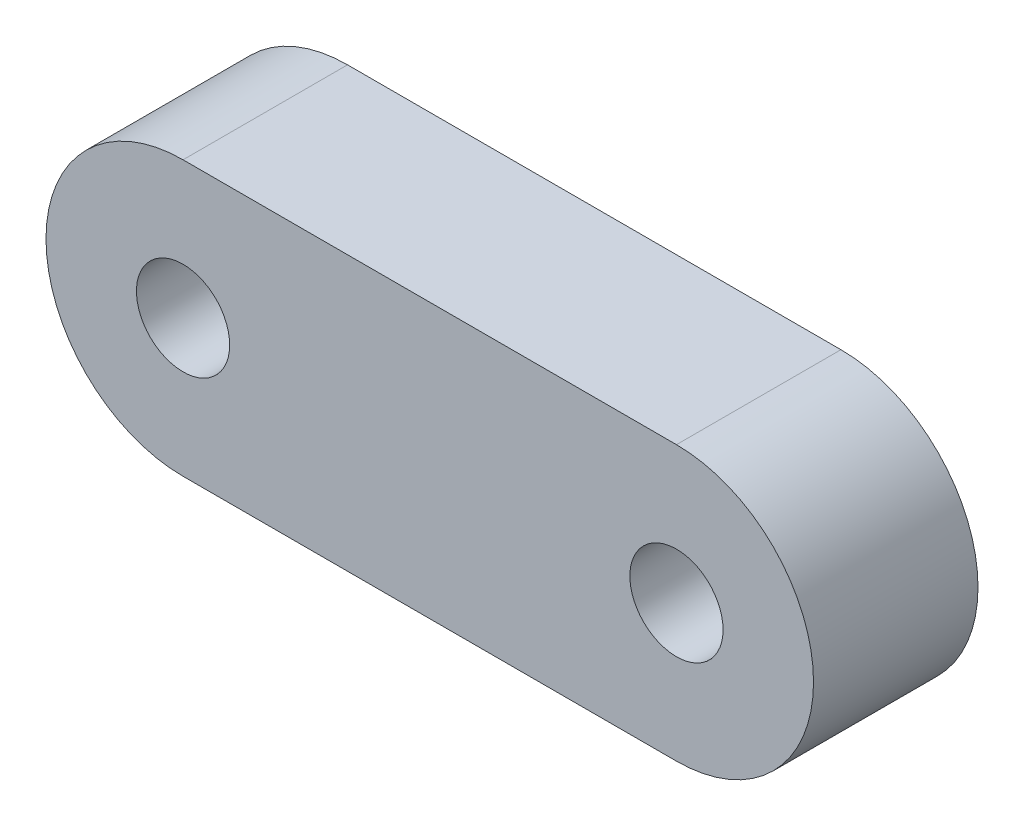
ISO-10303-21;
HEADER;
FILE_DESCRIPTION(('STEP AP214'),'2;1');
FILE_NAME('part.step','',(''),(''),'','','');
FILE_SCHEMA(('AUTOMOTIVE_DESIGN { 1 0 10303 214 1 1 1 1 }'));
ENDSEC;
DATA;
#1=APPLICATION_CONTEXT('core data for automotive mechanical design processes');
#2=APPLICATION_PROTOCOL_DEFINITION('international standard','automotive_design',2000,#1);
#3=PRODUCT_CONTEXT('',#1,'mechanical');
#4=PRODUCT('Part','Part','',(#3));
#5=PRODUCT_RELATED_PRODUCT_CATEGORY('part','',(#4));
#6=PRODUCT_DEFINITION_FORMATION('','',#4);
#7=PRODUCT_DEFINITION_CONTEXT('part definition',#1,'design');
#8=PRODUCT_DEFINITION('design','',#6,#7);
#9=PRODUCT_DEFINITION_SHAPE('','',#8);
#10=(LENGTH_UNIT() NAMED_UNIT(*) SI_UNIT(.MILLI.,.METRE.));
#11=(NAMED_UNIT(*) PLANE_ANGLE_UNIT() SI_UNIT($,.RADIAN.));
#12=(NAMED_UNIT(*) SI_UNIT($,.STERADIAN.) SOLID_ANGLE_UNIT());
#13=UNCERTAINTY_MEASURE_WITH_UNIT(LENGTH_MEASURE(1.E-05),#10,'distance_accuracy_value','');
#14=(GEOMETRIC_REPRESENTATION_CONTEXT(3) GLOBAL_UNCERTAINTY_ASSIGNED_CONTEXT((#13)) GLOBAL_UNIT_ASSIGNED_CONTEXT((#10,
#11,#12)) REPRESENTATION_CONTEXT('',''));
#15=CARTESIAN_POINT('',(0.,0.,0.));
#16=DIRECTION('',(0.,0.,1.));
#17=DIRECTION('',(1.,0.,0.));
#18=AXIS2_PLACEMENT_3D('',#15,#16,#17);
#19=CARTESIAN_POINT('',(7.56,0.,6.));
#20=DIRECTION('',(0.,0.,1.));
#21=DIRECTION('',(1.,0.,0.));
#22=AXIS2_PLACEMENT_3D('',#19,#20,#21);
#23=PLANE('',#22);
#24=CARTESIAN_POINT('',(7.56,0.,6.));
#25=DIRECTION('',(0.,0.,1.));
#26=DIRECTION('',(1.,0.,0.));
#27=AXIS2_PLACEMENT_3D('',#24,#25,#26);
#28=CIRCLE('',#27,1.7);
#29=CARTESIAN_POINT('',(9.26,0.,6.));
#30=VERTEX_POINT('',#29);
#31=EDGE_CURVE('E101',#30,#30,#28,.T.);
#32=ORIENTED_EDGE('',*,*,#31,.F.);
#33=EDGE_LOOP('',(#32));
#34=FACE_BOUND('',#33,.T.);
#35=CARTESIAN_POINT('',(7.56,0.,6.));
#36=DIRECTION('',(0.,0.,1.));
#37=DIRECTION('',(1.,0.,0.));
#38=AXIS2_PLACEMENT_3D('',#35,#36,#37);
#39=CIRCLE('',#38,5.);
#40=CARTESIAN_POINT('',(7.56,5.,6.));
#41=VERTEX_POINT('',#40);
#42=CARTESIAN_POINT('',(7.56,-5.,6.));
#43=VERTEX_POINT('',#42);
#44=EDGE_CURVE('E86',#41,#43,#39,.T.);
#45=ORIENTED_EDGE('',*,*,#44,.T.);
#46=DIRECTION('',(1.,0.,0.));
#47=VECTOR('',#46,1.);
#48=CARTESIAN_POINT('',(7.56,-5.,6.));
#49=LINE('',#48,#47);
#50=CARTESIAN_POINT('',(25.56,-5.,6.));
#51=VERTEX_POINT('',#50);
#52=EDGE_CURVE('E81',#43,#51,#49,.T.);
#53=ORIENTED_EDGE('',*,*,#52,.T.);
#54=CARTESIAN_POINT('',(25.56,0.,6.));
#55=DIRECTION('',(0.,0.,1.));
#56=DIRECTION('',(1.,0.,0.));
#57=AXIS2_PLACEMENT_3D('',#54,#55,#56);
#58=CIRCLE('',#57,5.);
#59=CARTESIAN_POINT('',(25.56,5.,6.));
#60=VERTEX_POINT('',#59);
#61=EDGE_CURVE('E84',#51,#60,#58,.T.);
#62=ORIENTED_EDGE('',*,*,#61,.T.);
#63=DIRECTION('',(-1.,0.,0.));
#64=VECTOR('',#63,1.);
#65=CARTESIAN_POINT('',(7.56,5.,6.));
#66=LINE('',#65,#64);
#67=EDGE_CURVE('E51',#60,#41,#66,.T.);
#68=ORIENTED_EDGE('',*,*,#67,.T.);
#69=EDGE_LOOP('',(#45,#53,#62,#68));
#70=FACE_BOUND('',#69,.T.);
#71=CARTESIAN_POINT('',(25.56,0.,6.));
#72=DIRECTION('',(0.,0.,1.));
#73=DIRECTION('',(1.,0.,0.));
#74=AXIS2_PLACEMENT_3D('',#71,#72,#73);
#75=CIRCLE('',#74,1.7);
#76=CARTESIAN_POINT('',(27.26,0.,6.));
#77=VERTEX_POINT('',#76);
#78=EDGE_CURVE('E116',#77,#77,#75,.T.);
#79=ORIENTED_EDGE('',*,*,#78,.F.);
#80=EDGE_LOOP('',(#79));
#81=FACE_BOUND('',#80,.T.);
#82=ADVANCED_FACE('F34',(#34,#70,#81),#23,.T.);
#83=CARTESIAN_POINT('',(7.56,0.,0.));
#84=DIRECTION('',(0.,0.,1.));
#85=DIRECTION('',(1.,0.,0.));
#86=AXIS2_PLACEMENT_3D('',#83,#84,#85);
#87=PLANE('',#86);
#88=CARTESIAN_POINT('',(7.56,0.,0.));
#89=DIRECTION('',(0.,0.,1.));
#90=DIRECTION('',(1.,0.,0.));
#91=AXIS2_PLACEMENT_3D('',#88,#89,#90);
#92=CIRCLE('',#91,1.7);
#93=CARTESIAN_POINT('',(9.26,0.,0.));
#94=VERTEX_POINT('',#93);
#95=EDGE_CURVE('E113',#94,#94,#92,.T.);
#96=ORIENTED_EDGE('',*,*,#95,.T.);
#97=EDGE_LOOP('',(#96));
#98=FACE_BOUND('',#97,.T.);
#99=CARTESIAN_POINT('',(7.56,0.,0.));
#100=DIRECTION('',(0.,0.,1.));
#101=DIRECTION('',(1.,0.,0.));
#102=AXIS2_PLACEMENT_3D('',#99,#100,#101);
#103=CIRCLE('',#102,5.);
#104=CARTESIAN_POINT('',(7.56,5.,0.));
#105=VERTEX_POINT('',#104);
#106=CARTESIAN_POINT('',(7.56,-5.,0.));
#107=VERTEX_POINT('',#106);
#108=EDGE_CURVE('E98',#105,#107,#103,.T.);
#109=ORIENTED_EDGE('',*,*,#108,.F.);
#110=DIRECTION('',(-1.,0.,0.));
#111=VECTOR('',#110,1.);
#112=CARTESIAN_POINT('',(7.56,5.,0.));
#113=LINE('',#112,#111);
#114=CARTESIAN_POINT('',(25.56,5.,0.));
#115=VERTEX_POINT('',#114);
#116=EDGE_CURVE('E74',#115,#105,#113,.T.);
#117=ORIENTED_EDGE('',*,*,#116,.F.);
#118=CARTESIAN_POINT('',(25.56,0.,0.));
#119=DIRECTION('',(0.,0.,1.));
#120=DIRECTION('',(1.,0.,0.));
#121=AXIS2_PLACEMENT_3D('',#118,#119,#120);
#122=CIRCLE('',#121,5.);
#123=CARTESIAN_POINT('',(25.56,-5.,0.));
#124=VERTEX_POINT('',#123);
#125=EDGE_CURVE('E68',#124,#115,#122,.T.);
#126=ORIENTED_EDGE('',*,*,#125,.F.);
#127=DIRECTION('',(1.,0.,0.));
#128=VECTOR('',#127,1.);
#129=CARTESIAN_POINT('',(7.56,-5.,0.));
#130=LINE('',#129,#128);
#131=EDGE_CURVE('E90',#107,#124,#130,.T.);
#132=ORIENTED_EDGE('',*,*,#131,.F.);
#133=EDGE_LOOP('',(#109,#117,#126,#132));
#134=FACE_BOUND('',#133,.T.);
#135=CARTESIAN_POINT('',(25.56,0.,0.));
#136=DIRECTION('',(0.,0.,1.));
#137=DIRECTION('',(1.,0.,0.));
#138=AXIS2_PLACEMENT_3D('',#135,#136,#137);
#139=CIRCLE('',#138,1.7);
#140=CARTESIAN_POINT('',(27.26,0.,0.));
#141=VERTEX_POINT('',#140);
#142=EDGE_CURVE('E119',#141,#141,#139,.T.);
#143=ORIENTED_EDGE('',*,*,#142,.T.);
#144=EDGE_LOOP('',(#143));
#145=FACE_BOUND('',#144,.T.);
#146=ADVANCED_FACE('F109',(#98,#134,#145),#87,.F.);
#147=CARTESIAN_POINT('',(7.56,0.,6.));
#148=DIRECTION('',(0.,0.,-1.));
#149=DIRECTION('',(-1.,0.,0.));
#150=AXIS2_PLACEMENT_3D('',#147,#148,#149);
#151=CYLINDRICAL_SURFACE('',#150,5.);
#152=ORIENTED_EDGE('',*,*,#108,.T.);
#153=DIRECTION('',(0.,0.,-1.));
#154=VECTOR('',#153,1.);
#155=CARTESIAN_POINT('',(7.56,-5.,6.));
#156=LINE('',#155,#154);
#157=EDGE_CURVE('E11',#43,#107,#156,.T.);
#158=ORIENTED_EDGE('',*,*,#157,.F.);
#159=ORIENTED_EDGE('',*,*,#44,.F.);
#160=DIRECTION('',(0.,0.,-1.));
#161=VECTOR('',#160,1.);
#162=CARTESIAN_POINT('',(7.56,5.,6.));
#163=LINE('',#162,#161);
#164=EDGE_CURVE('E94',#41,#105,#163,.T.);
#165=ORIENTED_EDGE('',*,*,#164,.T.);
#166=EDGE_LOOP('',(#152,#158,#159,#165));
#167=FACE_BOUND('',#166,.T.);
#168=ADVANCED_FACE('F36',(#167),#151,.T.);
#169=CARTESIAN_POINT('',(7.56,-5.,6.));
#170=DIRECTION('',(0.,1.,0.));
#171=DIRECTION('',(-1.,0.,0.));
#172=AXIS2_PLACEMENT_3D('',#169,#170,#171);
#173=PLANE('',#172);
#174=ORIENTED_EDGE('',*,*,#131,.T.);
#175=DIRECTION('',(0.,0.,-1.));
#176=VECTOR('',#175,1.);
#177=CARTESIAN_POINT('',(25.56,-5.,6.));
#178=LINE('',#177,#176);
#179=EDGE_CURVE('E43',#51,#124,#178,.T.);
#180=ORIENTED_EDGE('',*,*,#179,.F.);
#181=ORIENTED_EDGE('',*,*,#52,.F.);
#182=ORIENTED_EDGE('',*,*,#157,.T.);
#183=EDGE_LOOP('',(#174,#180,#181,#182));
#184=FACE_BOUND('',#183,.T.);
#185=ADVANCED_FACE('F89',(#184),#173,.F.);
#186=CARTESIAN_POINT('',(25.56,0.,6.));
#187=DIRECTION('',(0.,0.,-1.));
#188=DIRECTION('',(-1.,0.,0.));
#189=AXIS2_PLACEMENT_3D('',#186,#187,#188);
#190=CYLINDRICAL_SURFACE('',#189,5.);
#191=ORIENTED_EDGE('',*,*,#125,.T.);
#192=DIRECTION('',(0.,0.,-1.));
#193=VECTOR('',#192,1.);
#194=CARTESIAN_POINT('',(25.56,5.,6.));
#195=LINE('',#194,#193);
#196=EDGE_CURVE('E91',#60,#115,#195,.T.);
#197=ORIENTED_EDGE('',*,*,#196,.F.);
#198=ORIENTED_EDGE('',*,*,#61,.F.);
#199=ORIENTED_EDGE('',*,*,#179,.T.);
#200=EDGE_LOOP('',(#191,#197,#198,#199));
#201=FACE_BOUND('',#200,.T.);
#202=ADVANCED_FACE('F92',(#201),#190,.T.);
#203=CARTESIAN_POINT('',(7.56,5.,6.));
#204=DIRECTION('',(0.,-1.,0.));
#205=DIRECTION('',(1.,0.,0.));
#206=AXIS2_PLACEMENT_3D('',#203,#204,#205);
#207=PLANE('',#206);
#208=ORIENTED_EDGE('',*,*,#116,.T.);
#209=ORIENTED_EDGE('',*,*,#164,.F.);
#210=ORIENTED_EDGE('',*,*,#67,.F.);
#211=ORIENTED_EDGE('',*,*,#196,.T.);
#212=EDGE_LOOP('',(#208,#209,#210,#211));
#213=FACE_BOUND('',#212,.T.);
#214=ADVANCED_FACE('F106',(#213),#207,.F.);
#215=CARTESIAN_POINT('',(7.56,0.,6.));
#216=DIRECTION('',(0.,0.,-1.));
#217=DIRECTION('',(-1.,0.,0.));
#218=AXIS2_PLACEMENT_3D('',#215,#216,#217);
#219=CYLINDRICAL_SURFACE('',#218,1.7);
#220=ORIENTED_EDGE('',*,*,#31,.T.);
#221=EDGE_LOOP('',(#220));
#222=FACE_BOUND('',#221,.T.);
#223=ORIENTED_EDGE('',*,*,#95,.F.);
#224=EDGE_LOOP('',(#223));
#225=FACE_BOUND('',#224,.T.);
#226=ADVANCED_FACE('F137',(#222,#225),#219,.F.);
#227=CARTESIAN_POINT('',(25.56,0.,6.));
#228=DIRECTION('',(0.,0.,-1.));
#229=DIRECTION('',(-1.,0.,0.));
#230=AXIS2_PLACEMENT_3D('',#227,#228,#229);
#231=CYLINDRICAL_SURFACE('',#230,1.7);
#232=ORIENTED_EDGE('',*,*,#78,.T.);
#233=EDGE_LOOP('',(#232));
#234=FACE_BOUND('',#233,.T.);
#235=ORIENTED_EDGE('',*,*,#142,.F.);
#236=EDGE_LOOP('',(#235));
#237=FACE_BOUND('',#236,.T.);
#238=ADVANCED_FACE('F125',(#234,#237),#231,.F.);
#239=CLOSED_SHELL('',(#82,#146,#168,#185,#202,#214,#226,#238));
#240=MANIFOLD_SOLID_BREP('B2',#239);
#241=ADVANCED_BREP_SHAPE_REPRESENTATION('',(#18,#240),#14);
#242=SHAPE_DEFINITION_REPRESENTATION(#9,#241);
ENDSEC;
END-ISO-10303-21;
